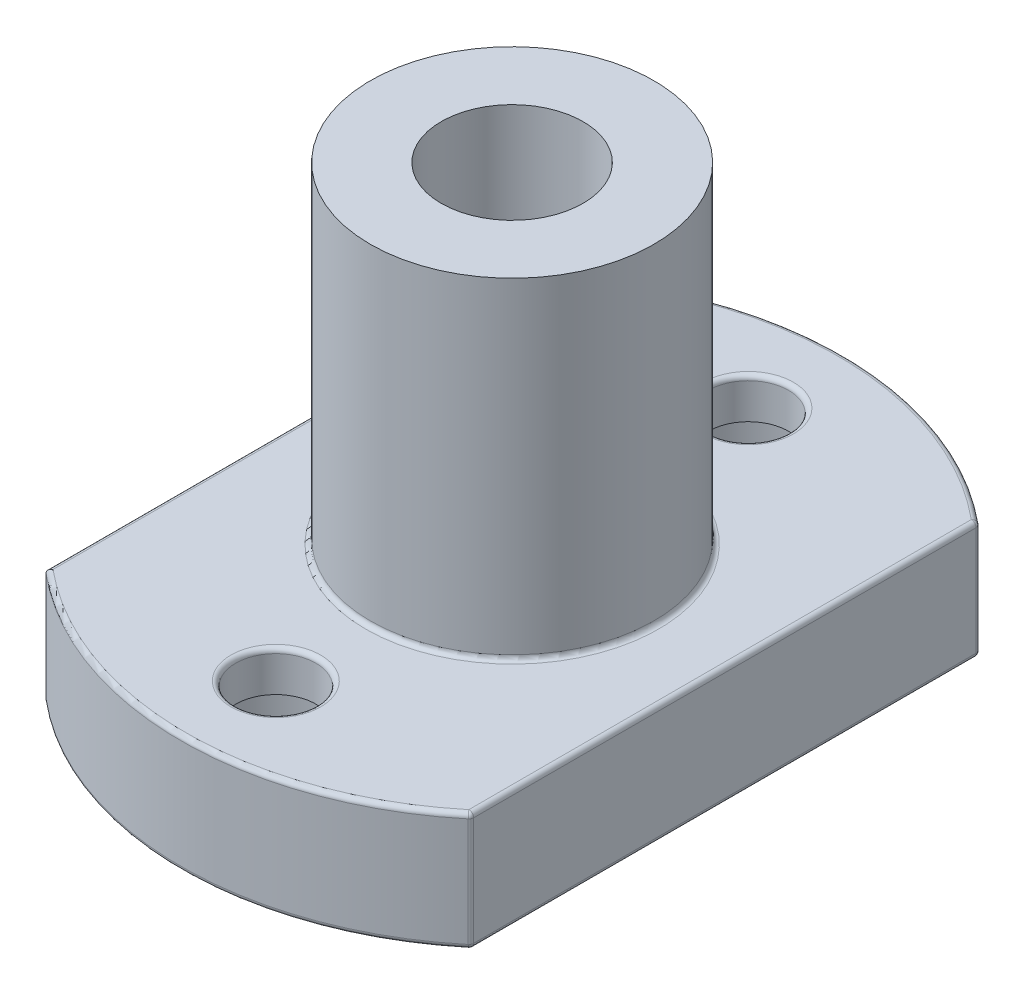
ISO-10303-21;
HEADER;
FILE_DESCRIPTION(('STEP AP214'),'2;1');
FILE_NAME('part.step','',(''),(''),'','','');
FILE_SCHEMA(('AUTOMOTIVE_DESIGN { 1 0 10303 214 1 1 1 1 }'));
ENDSEC;
DATA;
#1=APPLICATION_CONTEXT('core data for automotive mechanical design processes');
#2=APPLICATION_PROTOCOL_DEFINITION('international standard','automotive_design',2000,#1);
#3=PRODUCT_CONTEXT('',#1,'mechanical');
#4=PRODUCT('Part','Part','',(#3));
#5=PRODUCT_RELATED_PRODUCT_CATEGORY('part','',(#4));
#6=PRODUCT_DEFINITION_FORMATION('','',#4);
#7=PRODUCT_DEFINITION_CONTEXT('part definition',#1,'design');
#8=PRODUCT_DEFINITION('design','',#6,#7);
#9=PRODUCT_DEFINITION_SHAPE('','',#8);
#10=(LENGTH_UNIT() NAMED_UNIT(*) SI_UNIT(.MILLI.,.METRE.));
#11=(NAMED_UNIT(*) PLANE_ANGLE_UNIT() SI_UNIT($,.RADIAN.));
#12=(NAMED_UNIT(*) SI_UNIT($,.STERADIAN.) SOLID_ANGLE_UNIT());
#13=UNCERTAINTY_MEASURE_WITH_UNIT(LENGTH_MEASURE(1.E-05),#10,'distance_accuracy_value','');
#14=(GEOMETRIC_REPRESENTATION_CONTEXT(3) GLOBAL_UNCERTAINTY_ASSIGNED_CONTEXT((#13)) GLOBAL_UNIT_ASSIGNED_CONTEXT((#10,
#11,#12)) REPRESENTATION_CONTEXT('',''));
#15=CARTESIAN_POINT('',(0.,0.,0.));
#16=DIRECTION('',(0.,0.,1.));
#17=DIRECTION('',(1.,0.,0.));
#18=AXIS2_PLACEMENT_3D('',#15,#16,#17);
#19=CARTESIAN_POINT('',(0.,5.,0.));
#20=DIRECTION('',(0.,1.,0.));
#21=DIRECTION('',(0.,0.,1.));
#22=AXIS2_PLACEMENT_3D('',#19,#20,#21);
#23=PLANE('',#22);
#24=CARTESIAN_POINT('',(0.,5.,0.));
#25=DIRECTION('',(0.,1.,0.));
#26=DIRECTION('',(0.,0.,1.));
#27=AXIS2_PLACEMENT_3D('',#24,#25,#26);
#28=CIRCLE('',#27,6.2);
#29=CARTESIAN_POINT('',(0.,5.,6.2));
#30=VERTEX_POINT('',#29);
#31=EDGE_CURVE('E166',#30,#30,#28,.F.);
#32=ORIENTED_EDGE('',*,*,#31,.T.);
#33=EDGE_LOOP('',(#32));
#34=FACE_BOUND('',#33,.T.);
#35=CARTESIAN_POINT('',(0.,5.,10.));
#36=DIRECTION('',(0.,1.,0.));
#37=DIRECTION('',(0.,0.,1.));
#38=AXIS2_PLACEMENT_3D('',#35,#36,#37);
#39=CIRCLE('',#38,1.9);
#40=CARTESIAN_POINT('',(0.,5.,11.9));
#41=VERTEX_POINT('',#40);
#42=EDGE_CURVE('E165',#41,#41,#39,.F.);
#43=ORIENTED_EDGE('',*,*,#42,.T.);
#44=EDGE_LOOP('',(#43));
#45=FACE_BOUND('',#44,.T.);
#46=CARTESIAN_POINT('',(0.,5.,-10.));
#47=DIRECTION('',(0.,1.,0.));
#48=DIRECTION('',(0.,0.,1.));
#49=AXIS2_PLACEMENT_3D('',#46,#47,#48);
#50=CIRCLE('',#49,1.9);
#51=CARTESIAN_POINT('',(0.,5.,-8.1));
#52=VERTEX_POINT('',#51);
#53=EDGE_CURVE('E157',#52,#52,#50,.F.);
#54=ORIENTED_EDGE('',*,*,#53,.T.);
#55=EDGE_LOOP('',(#54));
#56=FACE_BOUND('',#55,.T.);
#57=CARTESIAN_POINT('',(0.,5.,0.));
#58=DIRECTION('',(0.,1.,0.));
#59=DIRECTION('',(0.,0.,1.));
#60=AXIS2_PLACEMENT_3D('',#57,#58,#59);
#61=CIRCLE('',#60,13.8);
#62=CARTESIAN_POINT('',(-8.8,5.,10.6301458127347));
#63=VERTEX_POINT('',#62);
#64=CARTESIAN_POINT('',(8.8,5.,10.6301458127347));
#65=VERTEX_POINT('',#64);
#66=EDGE_CURVE('E158',#63,#65,#61,.T.);
#67=ORIENTED_EDGE('',*,*,#66,.T.);
#68=DIRECTION('',(0.,0.,-1.));
#69=VECTOR('',#68,1.);
#70=CARTESIAN_POINT('',(8.8,5.,0.));
#71=LINE('',#70,#69);
#72=CARTESIAN_POINT('',(8.8,5.,-10.6301458127347));
#73=VERTEX_POINT('',#72);
#74=EDGE_CURVE('E128',#65,#73,#71,.T.);
#75=ORIENTED_EDGE('',*,*,#74,.T.);
#76=CARTESIAN_POINT('',(0.,5.,0.));
#77=DIRECTION('',(0.,1.,0.));
#78=DIRECTION('',(0.,0.,1.));
#79=AXIS2_PLACEMENT_3D('',#76,#77,#78);
#80=CIRCLE('',#79,13.8);
#81=CARTESIAN_POINT('',(-8.8,5.,-10.6301458127347));
#82=VERTEX_POINT('',#81);
#83=EDGE_CURVE('E150',#73,#82,#80,.T.);
#84=ORIENTED_EDGE('',*,*,#83,.T.);
#85=DIRECTION('',(0.,0.,-1.));
#86=VECTOR('',#85,1.);
#87=CARTESIAN_POINT('',(-8.8,5.,10.7238052947636));
#88=LINE('',#87,#86);
#89=EDGE_CURVE('E153',#82,#63,#88,.F.);
#90=ORIENTED_EDGE('',*,*,#89,.T.);
#91=EDGE_LOOP('',(#67,#75,#84,#90));
#92=FACE_BOUND('',#91,.T.);
#93=ADVANCED_FACE('F41',(#34,#45,#56,#92),#23,.T.);
#94=CARTESIAN_POINT('',(0.,0.,0.));
#95=DIRECTION('',(0.,1.,0.));
#96=DIRECTION('',(0.,0.,1.));
#97=AXIS2_PLACEMENT_3D('',#94,#95,#96);
#98=PLANE('',#97);
#99=CARTESIAN_POINT('',(0.,0.,0.));
#100=DIRECTION('',(0.,1.,0.));
#101=DIRECTION('',(0.,0.,1.));
#102=AXIS2_PLACEMENT_3D('',#99,#100,#101);
#103=CIRCLE('',#102,3.2);
#104=CARTESIAN_POINT('',(0.,0.,3.2));
#105=VERTEX_POINT('',#104);
#106=EDGE_CURVE('E316',#105,#105,#103,.T.);
#107=ORIENTED_EDGE('',*,*,#106,.T.);
#108=EDGE_LOOP('',(#107));
#109=FACE_BOUND('',#108,.T.);
#110=CARTESIAN_POINT('',(0.,0.,-10.));
#111=DIRECTION('',(0.,1.,0.));
#112=DIRECTION('',(0.,0.,1.));
#113=AXIS2_PLACEMENT_3D('',#110,#111,#112);
#114=CIRCLE('',#113,3.45);
#115=CARTESIAN_POINT('',(0.,0.,-6.55));
#116=VERTEX_POINT('',#115);
#117=EDGE_CURVE('E311',#116,#116,#114,.T.);
#118=ORIENTED_EDGE('',*,*,#117,.T.);
#119=EDGE_LOOP('',(#118));
#120=FACE_BOUND('',#119,.T.);
#121=CARTESIAN_POINT('',(0.,0.,10.));
#122=DIRECTION('',(0.,1.,0.));
#123=DIRECTION('',(0.,0.,1.));
#124=AXIS2_PLACEMENT_3D('',#121,#122,#123);
#125=CIRCLE('',#124,3.45);
#126=CARTESIAN_POINT('',(0.,0.,13.45));
#127=VERTEX_POINT('',#126);
#128=EDGE_CURVE('E309',#127,#127,#125,.T.);
#129=ORIENTED_EDGE('',*,*,#128,.T.);
#130=EDGE_LOOP('',(#129));
#131=FACE_BOUND('',#130,.T.);
#132=CARTESIAN_POINT('',(0.,0.,0.));
#133=DIRECTION('',(0.,1.,0.));
#134=DIRECTION('',(0.,0.,1.));
#135=AXIS2_PLACEMENT_3D('',#132,#133,#134);
#136=CIRCLE('',#135,13.8);
#137=CARTESIAN_POINT('',(8.8,0.,10.6301458127347));
#138=VERTEX_POINT('',#137);
#139=CARTESIAN_POINT('',(-8.8,0.,10.6301458127347));
#140=VERTEX_POINT('',#139);
#141=EDGE_CURVE('E64',#138,#140,#136,.F.);
#142=ORIENTED_EDGE('',*,*,#141,.T.);
#143=DIRECTION('',(0.,0.,-1.));
#144=VECTOR('',#143,1.);
#145=CARTESIAN_POINT('',(-8.8,0.,0.));
#146=LINE('',#145,#144);
#147=CARTESIAN_POINT('',(-8.8,0.,-10.6301458127347));
#148=VERTEX_POINT('',#147);
#149=EDGE_CURVE('E306',#140,#148,#146,.T.);
#150=ORIENTED_EDGE('',*,*,#149,.T.);
#151=CARTESIAN_POINT('',(0.,0.,0.));
#152=DIRECTION('',(0.,1.,0.));
#153=DIRECTION('',(0.,0.,1.));
#154=AXIS2_PLACEMENT_3D('',#151,#152,#153);
#155=CIRCLE('',#154,13.8);
#156=CARTESIAN_POINT('',(8.8,0.,-10.6301458127347));
#157=VERTEX_POINT('',#156);
#158=EDGE_CURVE('E200',#148,#157,#155,.F.);
#159=ORIENTED_EDGE('',*,*,#158,.T.);
#160=DIRECTION('',(0.,0.,-1.));
#161=VECTOR('',#160,1.);
#162=CARTESIAN_POINT('',(8.8,0.,10.7238052947636));
#163=LINE('',#162,#161);
#164=EDGE_CURVE('E301',#157,#138,#163,.F.);
#165=ORIENTED_EDGE('',*,*,#164,.T.);
#166=EDGE_LOOP('',(#142,#150,#159,#165));
#167=FACE_BOUND('',#166,.T.);
#168=ADVANCED_FACE('F235',(#109,#120,#131,#167),#98,.F.);
#169=CARTESIAN_POINT('',(0.,5.,0.));
#170=DIRECTION('',(0.,-1.,0.));
#171=DIRECTION('',(0.,0.,-1.));
#172=AXIS2_PLACEMENT_3D('',#169,#170,#171);
#173=CYLINDRICAL_SURFACE('',#172,14.);
#174=DIRECTION('',(0.,1.,0.));
#175=VECTOR('',#174,1.);
#176=CARTESIAN_POINT('',(-9.,0.,10.7238052947636));
#177=LINE('',#176,#175);
#178=CARTESIAN_POINT('',(-9.,0.2,10.7238052947636));
#179=VERTEX_POINT('',#178);
#180=CARTESIAN_POINT('',(-9.,4.8,10.7238052947636));
#181=VERTEX_POINT('',#180);
#182=EDGE_CURVE('E413',#179,#181,#177,.T.);
#183=ORIENTED_EDGE('',*,*,#182,.F.);
#184=CARTESIAN_POINT('',(0.,0.2,0.));
#185=DIRECTION('',(0.,1.,0.));
#186=DIRECTION('',(0.,0.,1.));
#187=AXIS2_PLACEMENT_3D('',#184,#185,#186);
#188=CIRCLE('',#187,14.);
#189=CARTESIAN_POINT('',(8.92753623188405,0.2,10.7842058969772));
#190=VERTEX_POINT('',#189);
#191=EDGE_CURVE('E302',#179,#190,#188,.T.);
#192=ORIENTED_EDGE('',*,*,#191,.T.);
#193=DIRECTION('',(0.,-1.,0.));
#194=VECTOR('',#193,1.);
#195=CARTESIAN_POINT('',(8.92753623188405,5.,10.7842058969772));
#196=LINE('',#195,#194);
#197=CARTESIAN_POINT('',(8.92753623188406,4.8,10.7842058969772));
#198=VERTEX_POINT('',#197);
#199=EDGE_CURVE('E303',#190,#198,#196,.F.);
#200=ORIENTED_EDGE('',*,*,#199,.T.);
#201=CARTESIAN_POINT('',(0.,4.8,0.));
#202=DIRECTION('',(0.,1.,0.));
#203=DIRECTION('',(0.,0.,1.));
#204=AXIS2_PLACEMENT_3D('',#201,#202,#203);
#205=CIRCLE('',#204,14.);
#206=EDGE_CURVE('E172',#198,#181,#205,.F.);
#207=ORIENTED_EDGE('',*,*,#206,.T.);
#208=EDGE_LOOP('',(#183,#192,#200,#207));
#209=FACE_BOUND('',#208,.T.);
#210=ADVANCED_FACE('F243',(#209),#173,.T.);
#211=CARTESIAN_POINT('',(0.,4.8,0.));
#212=DIRECTION('',(0.,1.,0.));
#213=DIRECTION('',(0.,0.,1.));
#214=AXIS2_PLACEMENT_3D('',#211,#212,#213);
#215=CIRCLE('',#214,14.);
#216=CARTESIAN_POINT('',(-8.92753623188405,4.8,-10.7842058969772));
#217=VERTEX_POINT('',#216);
#218=CARTESIAN_POINT('',(8.92753623188405,4.8,-10.7842058969772));
#219=VERTEX_POINT('',#218);
#220=EDGE_CURVE('E195',#217,#219,#215,.F.);
#221=ORIENTED_EDGE('',*,*,#220,.T.);
#222=DIRECTION('',(0.,-1.,0.));
#223=VECTOR('',#222,1.);
#224=CARTESIAN_POINT('',(8.92753623188405,5.,-10.7842058969772));
#225=LINE('',#224,#223);
#226=CARTESIAN_POINT('',(8.92753623188405,0.2,-10.7842058969772));
#227=VERTEX_POINT('',#226);
#228=EDGE_CURVE('E198',#219,#227,#225,.T.);
#229=ORIENTED_EDGE('',*,*,#228,.T.);
#230=CARTESIAN_POINT('',(0.,0.2,0.));
#231=DIRECTION('',(0.,1.,0.));
#232=DIRECTION('',(0.,0.,1.));
#233=AXIS2_PLACEMENT_3D('',#230,#231,#232);
#234=CIRCLE('',#233,14.);
#235=CARTESIAN_POINT('',(-8.92753623188405,0.2,-10.7842058969772));
#236=VERTEX_POINT('',#235);
#237=EDGE_CURVE('E189',#227,#236,#234,.T.);
#238=ORIENTED_EDGE('',*,*,#237,.T.);
#239=DIRECTION('',(0.,-1.,0.));
#240=VECTOR('',#239,1.);
#241=CARTESIAN_POINT('',(-8.92753623188405,5.,-10.7842058969772));
#242=LINE('',#241,#240);
#243=EDGE_CURVE('E194',#236,#217,#242,.F.);
#244=ORIENTED_EDGE('',*,*,#243,.T.);
#245=EDGE_LOOP('',(#221,#229,#238,#244));
#246=FACE_BOUND('',#245,.T.);
#247=ADVANCED_FACE('F247',(#246),#173,.T.);
#248=CARTESIAN_POINT('',(0.,19.,0.));
#249=DIRECTION('',(0.,-1.,0.));
#250=DIRECTION('',(0.,0.,-1.));
#251=AXIS2_PLACEMENT_3D('',#248,#249,#250);
#252=CYLINDRICAL_SURFACE('',#251,6.);
#253=CARTESIAN_POINT('',(0.,5.2,0.));
#254=DIRECTION('',(0.,1.,0.));
#255=DIRECTION('',(0.,0.,1.));
#256=AXIS2_PLACEMENT_3D('',#253,#254,#255);
#257=CIRCLE('',#256,6.);
#258=CARTESIAN_POINT('',(0.,5.2,6.));
#259=VERTEX_POINT('',#258);
#260=EDGE_CURVE('E152',#259,#259,#257,.T.);
#261=ORIENTED_EDGE('',*,*,#260,.T.);
#262=EDGE_LOOP('',(#261));
#263=FACE_BOUND('',#262,.T.);
#264=CARTESIAN_POINT('',(0.,19.,0.));
#265=DIRECTION('',(0.,1.,0.));
#266=DIRECTION('',(0.,0.,1.));
#267=AXIS2_PLACEMENT_3D('',#264,#265,#266);
#268=CIRCLE('',#267,6.);
#269=CARTESIAN_POINT('',(0.,19.,6.));
#270=VERTEX_POINT('',#269);
#271=EDGE_CURVE('E412',#270,#270,#268,.T.);
#272=ORIENTED_EDGE('',*,*,#271,.F.);
#273=EDGE_LOOP('',(#272));
#274=FACE_BOUND('',#273,.T.);
#275=ADVANCED_FACE('F248',(#263,#274),#252,.T.);
#276=CARTESIAN_POINT('',(0.,19.,0.));
#277=DIRECTION('',(0.,1.,0.));
#278=DIRECTION('',(0.,0.,1.));
#279=AXIS2_PLACEMENT_3D('',#276,#277,#278);
#280=PLANE('',#279);
#281=CARTESIAN_POINT('',(0.,19.,0.));
#282=DIRECTION('',(0.,1.,0.));
#283=DIRECTION('',(0.,0.,1.));
#284=AXIS2_PLACEMENT_3D('',#281,#282,#283);
#285=CIRCLE('',#284,3.);
#286=CARTESIAN_POINT('',(0.,19.,3.));
#287=VERTEX_POINT('',#286);
#288=EDGE_CURVE('E406',#287,#287,#285,.T.);
#289=ORIENTED_EDGE('',*,*,#288,.F.);
#290=EDGE_LOOP('',(#289));
#291=FACE_BOUND('',#290,.T.);
#292=ORIENTED_EDGE('',*,*,#271,.T.);
#293=EDGE_LOOP('',(#292));
#294=FACE_BOUND('',#293,.T.);
#295=ADVANCED_FACE('F258',(#291,#294),#280,.T.);
#296=CARTESIAN_POINT('',(9.,0.,0.));
#297=DIRECTION('',(1.,0.,0.));
#298=DIRECTION('',(0.,0.,-1.));
#299=AXIS2_PLACEMENT_3D('',#296,#297,#298);
#300=PLANE('',#299);
#301=DIRECTION('',(0.,1.,0.));
#302=VECTOR('',#301,1.);
#303=CARTESIAN_POINT('',(9.,0.,10.6301458127347));
#304=LINE('',#303,#302);
#305=CARTESIAN_POINT('',(9.,4.8,10.6301458127347));
#306=VERTEX_POINT('',#305);
#307=CARTESIAN_POINT('',(9.,0.2,10.6301458127347));
#308=VERTEX_POINT('',#307);
#309=EDGE_CURVE('E49',#306,#308,#304,.F.);
#310=ORIENTED_EDGE('',*,*,#309,.T.);
#311=DIRECTION('',(0.,0.,-1.));
#312=VECTOR('',#311,1.);
#313=CARTESIAN_POINT('',(9.,0.2,-10.4613574644976));
#314=LINE('',#313,#312);
#315=CARTESIAN_POINT('',(9.,0.2,-10.6301458127347));
#316=VERTEX_POINT('',#315);
#317=EDGE_CURVE('E11',#308,#316,#314,.T.);
#318=ORIENTED_EDGE('',*,*,#317,.T.);
#319=DIRECTION('',(0.,1.,0.));
#320=VECTOR('',#319,1.);
#321=CARTESIAN_POINT('',(9.,5.,-10.6301458127347));
#322=LINE('',#321,#320);
#323=CARTESIAN_POINT('',(9.,4.8,-10.6301458127347));
#324=VERTEX_POINT('',#323);
#325=EDGE_CURVE('E175',#316,#324,#322,.T.);
#326=ORIENTED_EDGE('',*,*,#325,.T.);
#327=DIRECTION('',(0.,0.,-1.));
#328=VECTOR('',#327,1.);
#329=CARTESIAN_POINT('',(9.,4.8,0.));
#330=LINE('',#329,#328);
#331=EDGE_CURVE('E135',#324,#306,#330,.F.);
#332=ORIENTED_EDGE('',*,*,#331,.T.);
#333=EDGE_LOOP('',(#310,#318,#326,#332));
#334=FACE_BOUND('',#333,.T.);
#335=ADVANCED_FACE('F438',(#334),#300,.T.);
#336=CARTESIAN_POINT('',(-9.,0.,0.));
#337=DIRECTION('',(1.,0.,0.));
#338=DIRECTION('',(0.,0.,-1.));
#339=AXIS2_PLACEMENT_3D('',#336,#337,#338);
#340=PLANE('',#339);
#341=DIRECTION('',(0.,-1.,0.));
#342=VECTOR('',#341,1.);
#343=CARTESIAN_POINT('',(-9.,0.,-10.6301458127347));
#344=LINE('',#343,#342);
#345=CARTESIAN_POINT('',(-9.,4.8,-10.6301458127347));
#346=VERTEX_POINT('',#345);
#347=CARTESIAN_POINT('',(-9.,0.2,-10.6301458127347));
#348=VERTEX_POINT('',#347);
#349=EDGE_CURVE('E177',#346,#348,#344,.T.);
#350=ORIENTED_EDGE('',*,*,#349,.T.);
#351=DIRECTION('',(0.,0.,-1.));
#352=VECTOR('',#351,1.);
#353=CARTESIAN_POINT('',(-9.,0.2,0.));
#354=LINE('',#353,#352);
#355=EDGE_CURVE('E317',#348,#179,#354,.F.);
#356=ORIENTED_EDGE('',*,*,#355,.T.);
#357=ORIENTED_EDGE('',*,*,#182,.T.);
#358=DIRECTION('',(0.,0.,-1.));
#359=VECTOR('',#358,1.);
#360=CARTESIAN_POINT('',(-9.,4.8,-10.7238052947636));
#361=LINE('',#360,#359);
#362=EDGE_CURVE('E182',#181,#346,#361,.T.);
#363=ORIENTED_EDGE('',*,*,#362,.T.);
#364=EDGE_LOOP('',(#350,#356,#357,#363));
#365=FACE_BOUND('',#364,.T.);
#366=ADVANCED_FACE('F439',(#365),#340,.F.);
#367=CARTESIAN_POINT('',(0.,-0.001000000000001,0.));
#368=DIRECTION('',(0.,1.,0.));
#369=DIRECTION('',(0.,0.,1.));
#370=AXIS2_PLACEMENT_3D('',#367,#368,#369);
#371=CYLINDRICAL_SURFACE('',#370,3.);
#372=CARTESIAN_POINT('',(0.,0.2,0.));
#373=DIRECTION('',(0.,1.,0.));
#374=DIRECTION('',(0.,0.,1.));
#375=AXIS2_PLACEMENT_3D('',#372,#373,#374);
#376=CIRCLE('',#375,3.);
#377=CARTESIAN_POINT('',(0.,0.2,3.));
#378=VERTEX_POINT('',#377);
#379=EDGE_CURVE('E321',#378,#378,#376,.F.);
#380=ORIENTED_EDGE('',*,*,#379,.T.);
#381=EDGE_LOOP('',(#380));
#382=FACE_BOUND('',#381,.T.);
#383=ORIENTED_EDGE('',*,*,#288,.T.);
#384=EDGE_LOOP('',(#383));
#385=FACE_BOUND('',#384,.T.);
#386=ADVANCED_FACE('F443',(#382,#385),#371,.F.);
#387=CARTESIAN_POINT('',(0.,3.3,10.));
#388=DIRECTION('',(0.,1.,0.));
#389=DIRECTION('',(0.,0.,1.));
#390=AXIS2_PLACEMENT_3D('',#387,#388,#389);
#391=CYLINDRICAL_SURFACE('',#390,1.7);
#392=CARTESIAN_POINT('',(0.,4.8,10.));
#393=DIRECTION('',(0.,1.,0.));
#394=DIRECTION('',(0.,0.,1.));
#395=AXIS2_PLACEMENT_3D('',#392,#393,#394);
#396=CIRCLE('',#395,1.7);
#397=CARTESIAN_POINT('',(0.,4.8,11.7));
#398=VERTEX_POINT('',#397);
#399=EDGE_CURVE('E181',#398,#398,#396,.T.);
#400=ORIENTED_EDGE('',*,*,#399,.T.);
#401=EDGE_LOOP('',(#400));
#402=FACE_BOUND('',#401,.T.);
#403=CARTESIAN_POINT('',(0.,3.3,10.));
#404=DIRECTION('',(0.,1.,0.));
#405=DIRECTION('',(0.,0.,1.));
#406=AXIS2_PLACEMENT_3D('',#403,#404,#405);
#407=CIRCLE('',#406,1.7);
#408=CARTESIAN_POINT('',(0.,3.3,11.7));
#409=VERTEX_POINT('',#408);
#410=EDGE_CURVE('E403',#409,#409,#407,.T.);
#411=ORIENTED_EDGE('',*,*,#410,.F.);
#412=EDGE_LOOP('',(#411));
#413=FACE_BOUND('',#412,.T.);
#414=ADVANCED_FACE('F452',(#402,#413),#391,.F.);
#415=CARTESIAN_POINT('',(0.,3.3,-10.));
#416=DIRECTION('',(0.,1.,0.));
#417=DIRECTION('',(0.,0.,1.));
#418=AXIS2_PLACEMENT_3D('',#415,#416,#417);
#419=CYLINDRICAL_SURFACE('',#418,1.7);
#420=CARTESIAN_POINT('',(0.,4.8,-10.));
#421=DIRECTION('',(0.,1.,0.));
#422=DIRECTION('',(0.,0.,1.));
#423=AXIS2_PLACEMENT_3D('',#420,#421,#422);
#424=CIRCLE('',#423,1.7);
#425=CARTESIAN_POINT('',(0.,4.8,-8.3));
#426=VERTEX_POINT('',#425);
#427=EDGE_CURVE('E188',#426,#426,#424,.T.);
#428=ORIENTED_EDGE('',*,*,#427,.T.);
#429=EDGE_LOOP('',(#428));
#430=FACE_BOUND('',#429,.T.);
#431=CARTESIAN_POINT('',(0.,3.3,-10.));
#432=DIRECTION('',(0.,1.,0.));
#433=DIRECTION('',(0.,0.,1.));
#434=AXIS2_PLACEMENT_3D('',#431,#432,#433);
#435=CIRCLE('',#434,1.7);
#436=CARTESIAN_POINT('',(0.,3.3,-8.3));
#437=VERTEX_POINT('',#436);
#438=EDGE_CURVE('E396',#437,#437,#435,.T.);
#439=ORIENTED_EDGE('',*,*,#438,.F.);
#440=EDGE_LOOP('',(#439));
#441=FACE_BOUND('',#440,.T.);
#442=ADVANCED_FACE('F460',(#430,#441),#419,.F.);
#443=CARTESIAN_POINT('',(0.,3.3,-10.));
#444=DIRECTION('',(0.,-1.,0.));
#445=DIRECTION('',(0.,0.,-1.));
#446=AXIS2_PLACEMENT_3D('',#443,#444,#445);
#447=PLANE('',#446);
#448=CARTESIAN_POINT('',(0.,3.3,-10.));
#449=DIRECTION('',(0.,-1.,0.));
#450=DIRECTION('',(0.,0.,-1.));
#451=AXIS2_PLACEMENT_3D('',#448,#449,#450);
#452=CIRCLE('',#451,3.25);
#453=CARTESIAN_POINT('',(0.,3.3,-13.25));
#454=VERTEX_POINT('',#453);
#455=EDGE_CURVE('E289',#454,#454,#452,.T.);
#456=ORIENTED_EDGE('',*,*,#455,.T.);
#457=EDGE_LOOP('',(#456));
#458=FACE_BOUND('',#457,.T.);
#459=ORIENTED_EDGE('',*,*,#438,.T.);
#460=EDGE_LOOP('',(#459));
#461=FACE_BOUND('',#460,.T.);
#462=ADVANCED_FACE('F395',(#458,#461),#447,.T.);
#463=CARTESIAN_POINT('',(0.,3.3,-10.));
#464=DIRECTION('',(0.,-1.,0.));
#465=DIRECTION('',(0.,0.,-1.));
#466=AXIS2_PLACEMENT_3D('',#463,#464,#465);
#467=CYLINDRICAL_SURFACE('',#466,3.25);
#468=CARTESIAN_POINT('',(0.,0.2,-10.));
#469=DIRECTION('',(0.,1.,0.));
#470=DIRECTION('',(0.,0.,1.));
#471=AXIS2_PLACEMENT_3D('',#468,#469,#470);
#472=CIRCLE('',#471,3.25);
#473=CARTESIAN_POINT('',(0.,0.2,-6.75));
#474=VERTEX_POINT('',#473);
#475=EDGE_CURVE('E322',#474,#474,#472,.F.);
#476=ORIENTED_EDGE('',*,*,#475,.T.);
#477=EDGE_LOOP('',(#476));
#478=FACE_BOUND('',#477,.T.);
#479=ORIENTED_EDGE('',*,*,#455,.F.);
#480=EDGE_LOOP('',(#479));
#481=FACE_BOUND('',#480,.T.);
#482=ADVANCED_FACE('F389',(#478,#481),#467,.F.);
#483=CARTESIAN_POINT('',(0.,3.3,10.));
#484=DIRECTION('',(0.,-1.,0.));
#485=DIRECTION('',(0.,0.,-1.));
#486=AXIS2_PLACEMENT_3D('',#483,#484,#485);
#487=PLANE('',#486);
#488=CARTESIAN_POINT('',(0.,3.3,10.));
#489=DIRECTION('',(0.,-1.,0.));
#490=DIRECTION('',(0.,0.,-1.));
#491=AXIS2_PLACEMENT_3D('',#488,#489,#490);
#492=CIRCLE('',#491,3.25);
#493=CARTESIAN_POINT('',(0.,3.3,6.75));
#494=VERTEX_POINT('',#493);
#495=EDGE_CURVE('E399',#494,#494,#492,.T.);
#496=ORIENTED_EDGE('',*,*,#495,.T.);
#497=EDGE_LOOP('',(#496));
#498=FACE_BOUND('',#497,.T.);
#499=ORIENTED_EDGE('',*,*,#410,.T.);
#500=EDGE_LOOP('',(#499));
#501=FACE_BOUND('',#500,.T.);
#502=ADVANCED_FACE('F393',(#498,#501),#487,.T.);
#503=CARTESIAN_POINT('',(0.,3.3,10.));
#504=DIRECTION('',(0.,-1.,0.));
#505=DIRECTION('',(0.,0.,-1.));
#506=AXIS2_PLACEMENT_3D('',#503,#504,#505);
#507=CYLINDRICAL_SURFACE('',#506,3.25);
#508=CARTESIAN_POINT('',(0.,0.2,10.));
#509=DIRECTION('',(0.,1.,0.));
#510=DIRECTION('',(0.,0.,1.));
#511=AXIS2_PLACEMENT_3D('',#508,#509,#510);
#512=CIRCLE('',#511,3.25);
#513=CARTESIAN_POINT('',(0.,0.2,13.25));
#514=VERTEX_POINT('',#513);
#515=EDGE_CURVE('E330',#514,#514,#512,.F.);
#516=ORIENTED_EDGE('',*,*,#515,.T.);
#517=EDGE_LOOP('',(#516));
#518=FACE_BOUND('',#517,.T.);
#519=ORIENTED_EDGE('',*,*,#495,.F.);
#520=EDGE_LOOP('',(#519));
#521=FACE_BOUND('',#520,.T.);
#522=ADVANCED_FACE('F464',(#518,#521),#507,.F.);
#523=CARTESIAN_POINT('',(0.,5.2,0.));
#524=DIRECTION('',(0.,1.,0.));
#525=DIRECTION('',(0.,0.,1.));
#526=AXIS2_PLACEMENT_3D('',#523,#524,#525);
#527=TOROIDAL_SURFACE('',#526,6.2,0.2);
#528=ORIENTED_EDGE('',*,*,#31,.F.);
#529=EDGE_LOOP('',(#528));
#530=FACE_BOUND('',#529,.T.);
#531=ORIENTED_EDGE('',*,*,#260,.F.);
#532=EDGE_LOOP('',(#531));
#533=FACE_BOUND('',#532,.T.);
#534=ADVANCED_FACE('F221',(#530,#533),#527,.F.);
#535=CARTESIAN_POINT('',(-8.8,5.,-10.6301458127347));
#536=DIRECTION('',(0.,-1.,0.));
#537=DIRECTION('',(0.,0.,-1.));
#538=AXIS2_PLACEMENT_3D('',#535,#536,#537);
#539=CYLINDRICAL_SURFACE('',#538,0.2);
#540=ORIENTED_EDGE('',*,*,#243,.F.);
#541=CARTESIAN_POINT('',(-8.8,0.2,-10.6301458127347));
#542=DIRECTION('',(0.,-1.,0.));
#543=DIRECTION('',(0.,0.,-1.));
#544=AXIS2_PLACEMENT_3D('',#541,#542,#543);
#545=CIRCLE('',#544,0.2);
#546=EDGE_CURVE('E275',#236,#348,#545,.F.);
#547=ORIENTED_EDGE('',*,*,#546,.T.);
#548=ORIENTED_EDGE('',*,*,#349,.F.);
#549=CARTESIAN_POINT('',(-8.8,4.8,-10.6301458127347));
#550=DIRECTION('',(0.,1.,0.));
#551=DIRECTION('',(0.,0.,1.));
#552=AXIS2_PLACEMENT_3D('',#549,#550,#551);
#553=CIRCLE('',#552,0.2);
#554=EDGE_CURVE('E284',#217,#346,#553,.T.);
#555=ORIENTED_EDGE('',*,*,#554,.F.);
#556=EDGE_LOOP('',(#540,#547,#548,#555));
#557=FACE_BOUND('',#556,.T.);
#558=ADVANCED_FACE('F283',(#557),#539,.T.);
#559=CARTESIAN_POINT('',(-8.8,4.8,-10.6301458127346));
#560=DIRECTION('',(0.,1.,0.));
#561=DIRECTION('',(0.,0.,1.));
#562=AXIS2_PLACEMENT_3D('',#559,#560,#561);
#563=SPHERICAL_SURFACE('',#562,0.2);
#564=CARTESIAN_POINT('',(-8.8,4.8,-10.6301458127347));
#565=DIRECTION('',(-0.770300421212659,0.,0.637681159420286));
#566=DIRECTION('',(0.637681159420286,0.,0.770300421212659));
#567=AXIS2_PLACEMENT_3D('',#564,#565,#566);
#568=CIRCLE('',#567,0.2);
#569=EDGE_CURVE('E147',#217,#82,#568,.F.);
#570=ORIENTED_EDGE('',*,*,#569,.F.);
#571=ORIENTED_EDGE('',*,*,#554,.T.);
#572=CARTESIAN_POINT('',(-8.8,4.8,-10.6301458127347));
#573=DIRECTION('',(0.,0.,-1.));
#574=DIRECTION('',(-1.,0.,0.));
#575=AXIS2_PLACEMENT_3D('',#572,#573,#574);
#576=CIRCLE('',#575,0.2);
#577=EDGE_CURVE('E287',#82,#346,#576,.F.);
#578=ORIENTED_EDGE('',*,*,#577,.F.);
#579=EDGE_LOOP('',(#570,#571,#578));
#580=FACE_BOUND('',#579,.T.);
#581=ADVANCED_FACE('F286',(#580),#563,.T.);
#582=CARTESIAN_POINT('',(0.,0.2,0.));
#583=DIRECTION('',(0.,1.,0.));
#584=DIRECTION('',(0.,0.,1.));
#585=AXIS2_PLACEMENT_3D('',#582,#583,#584);
#586=TOROIDAL_SURFACE('',#585,13.8,0.2);
#587=ORIENTED_EDGE('',*,*,#158,.F.);
#588=CARTESIAN_POINT('',(-8.8,0.2,-10.6301458127347));
#589=DIRECTION('',(-0.770300421212656,0.,0.63768115942029));
#590=DIRECTION('',(0.63768115942029,0.,0.770300421212656));
#591=AXIS2_PLACEMENT_3D('',#588,#589,#590);
#592=CIRCLE('',#591,0.2);
#593=EDGE_CURVE('E276',#148,#236,#592,.F.);
#594=ORIENTED_EDGE('',*,*,#593,.T.);
#595=ORIENTED_EDGE('',*,*,#237,.F.);
#596=CARTESIAN_POINT('',(8.8,0.2,-10.6301458127347));
#597=DIRECTION('',(-0.770300421212656,0.,-0.63768115942029));
#598=DIRECTION('',(-0.63768115942029,0.,0.770300421212656));
#599=AXIS2_PLACEMENT_3D('',#596,#597,#598);
#600=CIRCLE('',#599,0.2);
#601=EDGE_CURVE('E203',#227,#157,#600,.T.);
#602=ORIENTED_EDGE('',*,*,#601,.T.);
#603=EDGE_LOOP('',(#587,#594,#595,#602));
#604=FACE_BOUND('',#603,.T.);
#605=ADVANCED_FACE('F280',(#604),#586,.T.);
#606=CARTESIAN_POINT('',(-8.8,4.8,0.));
#607=DIRECTION('',(0.,0.,1.));
#608=DIRECTION('',(1.,0.,0.));
#609=AXIS2_PLACEMENT_3D('',#606,#607,#608);
#610=CYLINDRICAL_SURFACE('',#609,0.2);
#611=ORIENTED_EDGE('',*,*,#577,.T.);
#612=ORIENTED_EDGE('',*,*,#362,.F.);
#613=CARTESIAN_POINT('',(-9.,4.8,10.7238052947636));
#614=CARTESIAN_POINT('',(-9.00001241014495,4.81049490284209,10.7238110018747));
#615=CARTESIAN_POINT('',(-8.9991748008173,4.82098089653525,10.7234205434081));
#616=CARTESIAN_POINT('',(-8.99589786777855,4.84160981075553,10.7218925429749));
#617=CARTESIAN_POINT('',(-8.99346377077585,4.85175373761369,10.720757438886));
#618=CARTESIAN_POINT('',(-8.98709244953579,4.87144107898839,10.7177855248129));
#619=CARTESIAN_POINT('',(-8.98315588969218,4.88098475676728,10.7159490249878));
#620=CARTESIAN_POINT('',(-8.97393861070034,4.8992470877984,10.7116474339842));
#621=CARTESIAN_POINT('',(-8.96865721024509,4.90796531979297,10.7091820241938));
#622=CARTESIAN_POINT('',(-8.95671544631632,4.924699203594,10.7036051166547));
#623=CARTESIAN_POINT('',(-8.95001074741964,4.93267617781515,10.7004728335285));
#624=CARTESIAN_POINT('',(-8.93557349909274,4.94739816624066,10.6937246258355));
#625=CARTESIAN_POINT('',(-8.9278406161385,4.95414277899692,10.690108544331));
#626=CARTESIAN_POINT('',(-8.91084006371854,4.96684374105526,10.6821541741268));
#627=CARTESIAN_POINT('',(-8.90149707685685,4.97267684006244,10.6777802650772));
#628=CARTESIAN_POINT('',(-8.8821118845012,4.98269303676872,10.66869905183));
#629=CARTESIAN_POINT('',(-8.87206933547827,4.98687531699582,10.6639915838141));
#630=CARTESIAN_POINT('',(-8.85224264806462,4.99331813470522,10.6546912970346));
#631=CARTESIAN_POINT('',(-8.84248770313141,4.99569041190233,10.6501126054201));
#632=CARTESIAN_POINT('',(-8.82279247294946,4.9989467625493,10.6408620909587));
#633=CARTESIAN_POINT('',(-8.81285258256012,4.99983370480992,10.6361904653159));
#634=CARTESIAN_POINT('',(-8.80194407735218,4.99999292761809,10.631060200531));
#635=CARTESIAN_POINT('',(-8.80097197249164,5.0000000156272,10.6306029904061));
#636=CARTESIAN_POINT('',(-8.8,5.,10.6301458127347));
#637=B_SPLINE_CURVE_WITH_KNOTS('',3,(#613,#614,#615,#616,#617,#618,#619,#620,#621,#622,#623,
#624,#625,#626,#627,#628,#629,#630,#631,#632,#633,#634,#635,#636),.UNSPECIFIED.,.F.,.F.,(4,2,2,
2,2,2,2,2,2,2,2,4),(0.,0.0314302089064939,0.0627580292990873,0.0940720124524002,
0.125401891191605,0.157908275437989,0.19042523000098,0.225830807581498,0.261253895785905,
0.294257729692775,0.327197745389626,0.330420478773349),.UNSPECIFIED.);
#638=EDGE_CURVE('E145',#63,#181,#637,.F.);
#639=ORIENTED_EDGE('',*,*,#638,.F.);
#640=ORIENTED_EDGE('',*,*,#89,.F.);
#641=EDGE_LOOP('',(#611,#612,#639,#640));
#642=FACE_BOUND('',#641,.T.);
#643=ADVANCED_FACE('F213',(#642),#610,.T.);
#644=CARTESIAN_POINT('',(0.,4.8,0.));
#645=DIRECTION('',(0.,1.,0.));
#646=DIRECTION('',(0.,0.,1.));
#647=AXIS2_PLACEMENT_3D('',#644,#645,#646);
#648=TOROIDAL_SURFACE('',#647,13.8,0.2);
#649=ORIENTED_EDGE('',*,*,#569,.T.);
#650=ORIENTED_EDGE('',*,*,#83,.F.);
#651=CARTESIAN_POINT('',(8.8,4.8,-10.6301458127347));
#652=DIRECTION('',(0.770300421212654,0.,0.637681159420291));
#653=DIRECTION('',(0.637681159420291,0.,-0.770300421212654));
#654=AXIS2_PLACEMENT_3D('',#651,#652,#653);
#655=CIRCLE('',#654,0.2);
#656=EDGE_CURVE('E137',#219,#73,#655,.T.);
#657=ORIENTED_EDGE('',*,*,#656,.F.);
#658=ORIENTED_EDGE('',*,*,#220,.F.);
#659=EDGE_LOOP('',(#649,#650,#657,#658));
#660=FACE_BOUND('',#659,.T.);
#661=ADVANCED_FACE('F146',(#660),#648,.T.);
#662=CARTESIAN_POINT('',(8.8,5.,-10.6301458127347));
#663=DIRECTION('',(0.,-1.,0.));
#664=DIRECTION('',(0.,0.,-1.));
#665=AXIS2_PLACEMENT_3D('',#662,#663,#664);
#666=CYLINDRICAL_SURFACE('',#665,0.2);
#667=ORIENTED_EDGE('',*,*,#325,.F.);
#668=CARTESIAN_POINT('',(8.8,0.2,-10.6301458127347));
#669=DIRECTION('',(0.,-1.,0.));
#670=DIRECTION('',(0.,0.,-1.));
#671=AXIS2_PLACEMENT_3D('',#668,#669,#670);
#672=CIRCLE('',#671,0.2);
#673=EDGE_CURVE('E266',#316,#227,#672,.F.);
#674=ORIENTED_EDGE('',*,*,#673,.T.);
#675=ORIENTED_EDGE('',*,*,#228,.F.);
#676=CARTESIAN_POINT('',(8.8,4.8,-10.6301458127347));
#677=DIRECTION('',(0.,1.,0.));
#678=DIRECTION('',(0.,0.,1.));
#679=AXIS2_PLACEMENT_3D('',#676,#677,#678);
#680=CIRCLE('',#679,0.2);
#681=EDGE_CURVE('E132',#324,#219,#680,.T.);
#682=ORIENTED_EDGE('',*,*,#681,.F.);
#683=EDGE_LOOP('',(#667,#674,#675,#682));
#684=FACE_BOUND('',#683,.T.);
#685=ADVANCED_FACE('F225',(#684),#666,.T.);
#686=CARTESIAN_POINT('',(0.,4.8,0.));
#687=DIRECTION('',(0.,1.,0.));
#688=DIRECTION('',(0.,0.,1.));
#689=AXIS2_PLACEMENT_3D('',#686,#687,#688);
#690=TOROIDAL_SURFACE('',#689,13.8,0.2);
#691=ORIENTED_EDGE('',*,*,#206,.F.);
#692=CARTESIAN_POINT('',(8.8,4.8,10.6301458127347));
#693=DIRECTION('',(0.770300421212656,0.,-0.63768115942029));
#694=DIRECTION('',(-0.63768115942029,0.,-0.770300421212656));
#695=AXIS2_PLACEMENT_3D('',#692,#693,#694);
#696=CIRCLE('',#695,0.2);
#697=EDGE_CURVE('E299',#198,#65,#696,.F.);
#698=ORIENTED_EDGE('',*,*,#697,.T.);
#699=ORIENTED_EDGE('',*,*,#66,.F.);
#700=ORIENTED_EDGE('',*,*,#638,.T.);
#701=EDGE_LOOP('',(#691,#698,#699,#700));
#702=FACE_BOUND('',#701,.T.);
#703=ADVANCED_FACE('F220',(#702),#690,.T.);
#704=CARTESIAN_POINT('',(8.8,4.8,-10.6301458127347));
#705=DIRECTION('',(0.,1.,0.));
#706=DIRECTION('',(0.,0.,1.));
#707=AXIS2_PLACEMENT_3D('',#704,#705,#706);
#708=SPHERICAL_SURFACE('',#707,0.2);
#709=ORIENTED_EDGE('',*,*,#681,.T.);
#710=ORIENTED_EDGE('',*,*,#656,.T.);
#711=CARTESIAN_POINT('',(8.8,4.8,-10.6301458127347));
#712=DIRECTION('',(0.,0.,-1.));
#713=DIRECTION('',(-1.,0.,0.));
#714=AXIS2_PLACEMENT_3D('',#711,#712,#713);
#715=CIRCLE('',#714,0.2);
#716=EDGE_CURVE('E127',#324,#73,#715,.F.);
#717=ORIENTED_EDGE('',*,*,#716,.F.);
#718=EDGE_LOOP('',(#709,#710,#717));
#719=FACE_BOUND('',#718,.T.);
#720=ADVANCED_FACE('F136',(#719),#708,.T.);
#721=CARTESIAN_POINT('',(8.8,4.8,0.));
#722=DIRECTION('',(0.,0.,-1.));
#723=DIRECTION('',(-1.,0.,0.));
#724=AXIS2_PLACEMENT_3D('',#721,#722,#723);
#725=CYLINDRICAL_SURFACE('',#724,0.2);
#726=ORIENTED_EDGE('',*,*,#74,.F.);
#727=CARTESIAN_POINT('',(8.8,4.8,10.6301458127347));
#728=DIRECTION('',(0.,0.,-1.));
#729=DIRECTION('',(-1.,0.,0.));
#730=AXIS2_PLACEMENT_3D('',#727,#728,#729);
#731=CIRCLE('',#730,0.2);
#732=EDGE_CURVE('E271',#65,#306,#731,.T.);
#733=ORIENTED_EDGE('',*,*,#732,.T.);
#734=ORIENTED_EDGE('',*,*,#331,.F.);
#735=ORIENTED_EDGE('',*,*,#716,.T.);
#736=EDGE_LOOP('',(#726,#733,#734,#735));
#737=FACE_BOUND('',#736,.T.);
#738=ADVANCED_FACE('F126',(#737),#725,.T.);
#739=CARTESIAN_POINT('',(0.,4.8,10.));
#740=DIRECTION('',(0.,1.,0.));
#741=DIRECTION('',(0.,0.,1.));
#742=AXIS2_PLACEMENT_3D('',#739,#740,#741);
#743=TOROIDAL_SURFACE('',#742,1.9,0.2);
#744=ORIENTED_EDGE('',*,*,#42,.F.);
#745=EDGE_LOOP('',(#744));
#746=FACE_BOUND('',#745,.T.);
#747=ORIENTED_EDGE('',*,*,#399,.F.);
#748=EDGE_LOOP('',(#747));
#749=FACE_BOUND('',#748,.T.);
#750=ADVANCED_FACE('F230',(#746,#749),#743,.T.);
#751=CARTESIAN_POINT('',(0.,4.8,-10.));
#752=DIRECTION('',(0.,1.,0.));
#753=DIRECTION('',(0.,0.,1.));
#754=AXIS2_PLACEMENT_3D('',#751,#752,#753);
#755=TOROIDAL_SURFACE('',#754,1.9,0.2);
#756=ORIENTED_EDGE('',*,*,#53,.F.);
#757=EDGE_LOOP('',(#756));
#758=FACE_BOUND('',#757,.T.);
#759=ORIENTED_EDGE('',*,*,#427,.F.);
#760=EDGE_LOOP('',(#759));
#761=FACE_BOUND('',#760,.T.);
#762=ADVANCED_FACE('F373',(#758,#761),#755,.T.);
#763=CARTESIAN_POINT('',(8.8,0.2,-10.6301458127347));
#764=DIRECTION('',(0.,0.,1.));
#765=DIRECTION('',(1.,0.,0.));
#766=AXIS2_PLACEMENT_3D('',#763,#764,#765);
#767=SPHERICAL_SURFACE('',#766,0.2);
#768=ORIENTED_EDGE('',*,*,#601,.F.);
#769=ORIENTED_EDGE('',*,*,#673,.F.);
#770=CARTESIAN_POINT('',(8.8,0.2,-10.6301458127347));
#771=DIRECTION('',(0.,0.,1.));
#772=DIRECTION('',(1.,0.,0.));
#773=AXIS2_PLACEMENT_3D('',#770,#771,#772);
#774=CIRCLE('',#773,0.2);
#775=EDGE_CURVE('E44',#157,#316,#774,.T.);
#776=ORIENTED_EDGE('',*,*,#775,.F.);
#777=EDGE_LOOP('',(#768,#769,#776));
#778=FACE_BOUND('',#777,.T.);
#779=ADVANCED_FACE('F369',(#778),#767,.T.);
#780=CARTESIAN_POINT('',(8.8,4.8,10.6301458127347));
#781=DIRECTION('',(0.,0.,1.));
#782=DIRECTION('',(1.,0.,0.));
#783=AXIS2_PLACEMENT_3D('',#780,#781,#782);
#784=SPHERICAL_SURFACE('',#783,0.2);
#785=ORIENTED_EDGE('',*,*,#732,.F.);
#786=ORIENTED_EDGE('',*,*,#697,.F.);
#787=CARTESIAN_POINT('',(8.8,4.8,10.6301458127347));
#788=DIRECTION('',(0.,-1.,0.));
#789=DIRECTION('',(0.,0.,-1.));
#790=AXIS2_PLACEMENT_3D('',#787,#788,#789);
#791=CIRCLE('',#790,0.2);
#792=EDGE_CURVE('E425',#306,#198,#791,.T.);
#793=ORIENTED_EDGE('',*,*,#792,.F.);
#794=EDGE_LOOP('',(#785,#786,#793));
#795=FACE_BOUND('',#794,.T.);
#796=ADVANCED_FACE('F364',(#795),#784,.T.);
#797=CARTESIAN_POINT('',(8.8,5.,10.6301458127347));
#798=DIRECTION('',(0.,-1.,0.));
#799=DIRECTION('',(0.,0.,-1.));
#800=AXIS2_PLACEMENT_3D('',#797,#798,#799);
#801=CYLINDRICAL_SURFACE('',#800,0.2);
#802=ORIENTED_EDGE('',*,*,#792,.T.);
#803=ORIENTED_EDGE('',*,*,#199,.F.);
#804=CARTESIAN_POINT('',(8.8,0.2,10.6301458127347));
#805=DIRECTION('',(0.,-1.,0.));
#806=DIRECTION('',(0.,0.,-1.));
#807=AXIS2_PLACEMENT_3D('',#804,#805,#806);
#808=CIRCLE('',#807,0.2);
#809=EDGE_CURVE('E426',#308,#190,#808,.T.);
#810=ORIENTED_EDGE('',*,*,#809,.F.);
#811=ORIENTED_EDGE('',*,*,#309,.F.);
#812=EDGE_LOOP('',(#802,#803,#810,#811));
#813=FACE_BOUND('',#812,.T.);
#814=ADVANCED_FACE('F363',(#813),#801,.T.);
#815=CARTESIAN_POINT('',(8.8,0.2,0.));
#816=DIRECTION('',(0.,0.,1.));
#817=DIRECTION('',(1.,0.,0.));
#818=AXIS2_PLACEMENT_3D('',#815,#816,#817);
#819=CYLINDRICAL_SURFACE('',#818,0.2);
#820=ORIENTED_EDGE('',*,*,#775,.T.);
#821=ORIENTED_EDGE('',*,*,#317,.F.);
#822=CARTESIAN_POINT('',(8.8,0.2,10.6301458127347));
#823=DIRECTION('',(0.,0.,1.));
#824=DIRECTION('',(1.,0.,0.));
#825=AXIS2_PLACEMENT_3D('',#822,#823,#824);
#826=CIRCLE('',#825,0.2);
#827=EDGE_CURVE('E430',#138,#308,#826,.T.);
#828=ORIENTED_EDGE('',*,*,#827,.F.);
#829=ORIENTED_EDGE('',*,*,#164,.F.);
#830=EDGE_LOOP('',(#820,#821,#828,#829));
#831=FACE_BOUND('',#830,.T.);
#832=ADVANCED_FACE('F359',(#831),#819,.T.);
#833=CARTESIAN_POINT('',(8.8,0.2,10.6301458127347));
#834=DIRECTION('',(0.,-1.,0.));
#835=DIRECTION('',(0.,0.,-1.));
#836=AXIS2_PLACEMENT_3D('',#833,#834,#835);
#837=SPHERICAL_SURFACE('',#836,0.2);
#838=ORIENTED_EDGE('',*,*,#827,.T.);
#839=ORIENTED_EDGE('',*,*,#809,.T.);
#840=CARTESIAN_POINT('',(8.8,0.2,10.6301458127347));
#841=DIRECTION('',(0.770300421212654,0.,-0.637681159420291));
#842=DIRECTION('',(-0.637681159420291,0.,-0.770300421212654));
#843=AXIS2_PLACEMENT_3D('',#840,#841,#842);
#844=CIRCLE('',#843,0.2);
#845=EDGE_CURVE('E342',#138,#190,#844,.F.);
#846=ORIENTED_EDGE('',*,*,#845,.F.);
#847=EDGE_LOOP('',(#838,#839,#846));
#848=FACE_BOUND('',#847,.T.);
#849=ADVANCED_FACE('F354',(#848),#837,.T.);
#850=CARTESIAN_POINT('',(0.,0.2,0.));
#851=DIRECTION('',(0.,1.,0.));
#852=DIRECTION('',(0.,0.,1.));
#853=AXIS2_PLACEMENT_3D('',#850,#851,#852);
#854=TOROIDAL_SURFACE('',#853,13.8,0.2);
#855=ORIENTED_EDGE('',*,*,#845,.T.);
#856=ORIENTED_EDGE('',*,*,#191,.F.);
#857=CARTESIAN_POINT('',(-9.,0.2,10.7238052947636));
#858=CARTESIAN_POINT('',(-9.00001241014495,0.189505097157909,10.7238110018747));
#859=CARTESIAN_POINT('',(-8.9991748008173,0.179019103464749,10.7234205434081));
#860=CARTESIAN_POINT('',(-8.99589786777855,0.158390189244466,10.7218925429749));
#861=CARTESIAN_POINT('',(-8.99346377077585,0.14824626238631,10.720757438886));
#862=CARTESIAN_POINT('',(-8.98709244953579,0.12855892101161,10.7177855248129));
#863=CARTESIAN_POINT('',(-8.98315588969218,0.119015243232725,10.7159490249878));
#864=CARTESIAN_POINT('',(-8.97393861070033,0.100752912201603,10.7116474339842));
#865=CARTESIAN_POINT('',(-8.96865721024509,0.0920346802070259,10.7091820241938));
#866=CARTESIAN_POINT('',(-8.95671544631632,0.0753007964060028,10.7036051166547));
#867=CARTESIAN_POINT('',(-8.95001074741964,0.0673238221848509,10.7004728335285));
#868=CARTESIAN_POINT('',(-8.93557349909274,0.0526018337593436,10.6937246258355));
#869=CARTESIAN_POINT('',(-8.9278406161385,0.0458572210030833,10.690108544331));
#870=CARTESIAN_POINT('',(-8.91084006371854,0.0331562589447384,10.6821541741268));
#871=CARTESIAN_POINT('',(-8.90149707685685,0.0273231599375578,10.6777802650772));
#872=CARTESIAN_POINT('',(-8.8821118845012,0.0173069632312768,10.66869905183));
#873=CARTESIAN_POINT('',(-8.87206933547827,0.0131246830041829,10.6639915838141));
#874=CARTESIAN_POINT('',(-8.85224264806462,0.00668186529477829,10.6546912970346));
#875=CARTESIAN_POINT('',(-8.84248770313143,0.00430958809767349,10.6501126054201));
#876=CARTESIAN_POINT('',(-8.82279247294945,0.00105323745070186,10.6408620909587));
#877=CARTESIAN_POINT('',(-8.81285258256007,0.000166295190077336,10.636190465316));
#878=CARTESIAN_POINT('',(-8.80194407735217,7.07238191309465E-06,10.631060200531));
#879=CARTESIAN_POINT('',(-8.80097197249164,-1.56271994371213E-08,10.6306029904061));
#880=CARTESIAN_POINT('',(-8.8,0.,10.6301458127347));
#881=B_SPLINE_CURVE_WITH_KNOTS('',3,(#857,#858,#859,#860,#861,#862,#863,#864,#865,#866,#867,
#868,#869,#870,#871,#872,#873,#874,#875,#876,#877,#878,#879,#880),.UNSPECIFIED.,.F.,.F.,(4,2,2,
2,2,2,2,2,2,2,2,4),(0.,0.0314302089064946,0.0627580292990877,0.0940720124523997,
0.125401891191606,0.157908275437991,0.19042523000098,0.225830807581497,0.261253895785904,
0.294257729692775,0.327197745389628,0.33042047877335),.UNSPECIFIED.);
#882=EDGE_CURVE('E331',#140,#179,#881,.F.);
#883=ORIENTED_EDGE('',*,*,#882,.F.);
#884=ORIENTED_EDGE('',*,*,#141,.F.);
#885=EDGE_LOOP('',(#855,#856,#883,#884));
#886=FACE_BOUND('',#885,.T.);
#887=ADVANCED_FACE('F341',(#886),#854,.T.);
#888=CARTESIAN_POINT('',(-8.8,0.2,0.));
#889=DIRECTION('',(0.,0.,-1.));
#890=DIRECTION('',(-1.,0.,0.));
#891=AXIS2_PLACEMENT_3D('',#888,#889,#890);
#892=CYLINDRICAL_SURFACE('',#891,0.2);
#893=CARTESIAN_POINT('',(-8.8,0.2,-10.6301458127347));
#894=DIRECTION('',(0.,0.,-1.));
#895=DIRECTION('',(-1.,0.,0.));
#896=AXIS2_PLACEMENT_3D('',#893,#894,#895);
#897=CIRCLE('',#896,0.2);
#898=EDGE_CURVE('E332',#148,#348,#897,.T.);
#899=ORIENTED_EDGE('',*,*,#898,.F.);
#900=ORIENTED_EDGE('',*,*,#149,.F.);
#901=ORIENTED_EDGE('',*,*,#882,.T.);
#902=ORIENTED_EDGE('',*,*,#355,.F.);
#903=EDGE_LOOP('',(#899,#900,#901,#902));
#904=FACE_BOUND('',#903,.T.);
#905=ADVANCED_FACE('F346',(#904),#892,.T.);
#906=CARTESIAN_POINT('',(-8.8,0.2,-10.6301458127347));
#907=DIRECTION('',(0.,0.,1.));
#908=DIRECTION('',(1.,0.,0.));
#909=AXIS2_PLACEMENT_3D('',#906,#907,#908);
#910=SPHERICAL_SURFACE('',#909,0.2);
#911=ORIENTED_EDGE('',*,*,#898,.T.);
#912=ORIENTED_EDGE('',*,*,#546,.F.);
#913=ORIENTED_EDGE('',*,*,#593,.F.);
#914=EDGE_LOOP('',(#911,#912,#913));
#915=FACE_BOUND('',#914,.T.);
#916=ADVANCED_FACE('F355',(#915),#910,.T.);
#917=CARTESIAN_POINT('',(0.,0.2,0.));
#918=DIRECTION('',(0.,1.,0.));
#919=DIRECTION('',(0.,0.,1.));
#920=AXIS2_PLACEMENT_3D('',#917,#918,#919);
#921=TOROIDAL_SURFACE('',#920,3.2,0.2);
#922=ORIENTED_EDGE('',*,*,#106,.F.);
#923=EDGE_LOOP('',(#922));
#924=FACE_BOUND('',#923,.T.);
#925=ORIENTED_EDGE('',*,*,#379,.F.);
#926=EDGE_LOOP('',(#925));
#927=FACE_BOUND('',#926,.T.);
#928=ADVANCED_FACE('F372',(#924,#927),#921,.T.);
#929=CARTESIAN_POINT('',(0.,0.2,-10.));
#930=DIRECTION('',(0.,1.,0.));
#931=DIRECTION('',(0.,0.,1.));
#932=AXIS2_PLACEMENT_3D('',#929,#930,#931);
#933=TOROIDAL_SURFACE('',#932,3.45,0.2);
#934=ORIENTED_EDGE('',*,*,#117,.F.);
#935=EDGE_LOOP('',(#934));
#936=FACE_BOUND('',#935,.T.);
#937=ORIENTED_EDGE('',*,*,#475,.F.);
#938=EDGE_LOOP('',(#937));
#939=FACE_BOUND('',#938,.T.);
#940=ADVANCED_FACE('F376',(#936,#939),#933,.T.);
#941=CARTESIAN_POINT('',(0.,0.2,10.));
#942=DIRECTION('',(0.,1.,0.));
#943=DIRECTION('',(0.,0.,1.));
#944=AXIS2_PLACEMENT_3D('',#941,#942,#943);
#945=TOROIDAL_SURFACE('',#944,3.45,0.2);
#946=ORIENTED_EDGE('',*,*,#128,.F.);
#947=EDGE_LOOP('',(#946));
#948=FACE_BOUND('',#947,.T.);
#949=ORIENTED_EDGE('',*,*,#515,.F.);
#950=EDGE_LOOP('',(#949));
#951=FACE_BOUND('',#950,.T.);
#952=ADVANCED_FACE('F43',(#948,#951),#945,.T.);
#953=CLOSED_SHELL('',(#93,#168,#210,#247,#275,#295,#335,#366,#386,#414,#442,#462,#482,#502,#522,
#534,#558,#581,#605,#643,#661,#685,#703,#720,#738,#750,#762,#779,#796,#814,#832,#849,#887,#905,
#916,#928,#940,#952));
#954=MANIFOLD_SOLID_BREP('B2',#953);
#955=ADVANCED_BREP_SHAPE_REPRESENTATION('',(#18,#954),#14);
#956=SHAPE_DEFINITION_REPRESENTATION(#9,#955);
ENDSEC;
END-ISO-10303-21;
